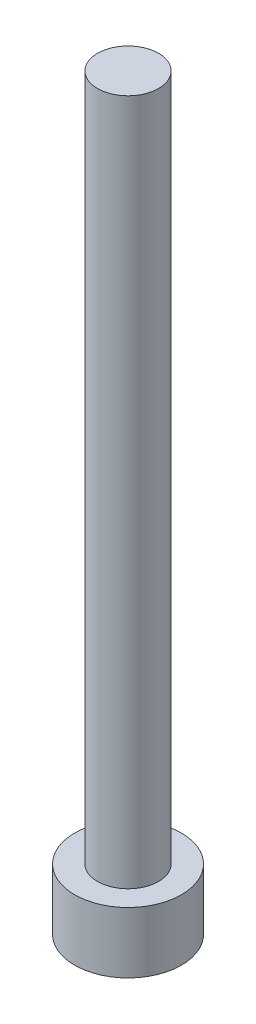
ISO-10303-21;
HEADER;
FILE_DESCRIPTION(('STEP AP214'),'2;1');
FILE_NAME('part.step','',(''),(''),'','','');
FILE_SCHEMA(('AUTOMOTIVE_DESIGN { 1 0 10303 214 1 1 1 1 }'));
ENDSEC;
DATA;
#1=APPLICATION_CONTEXT('core data for automotive mechanical design processes');
#2=APPLICATION_PROTOCOL_DEFINITION('international standard','automotive_design',2000,#1);
#3=PRODUCT_CONTEXT('',#1,'mechanical');
#4=PRODUCT('Part','Part','',(#3));
#5=PRODUCT_RELATED_PRODUCT_CATEGORY('part','',(#4));
#6=PRODUCT_DEFINITION_FORMATION('','',#4);
#7=PRODUCT_DEFINITION_CONTEXT('part definition',#1,'design');
#8=PRODUCT_DEFINITION('design','',#6,#7);
#9=PRODUCT_DEFINITION_SHAPE('','',#8);
#10=(LENGTH_UNIT() NAMED_UNIT(*) SI_UNIT(.MILLI.,.METRE.));
#11=(NAMED_UNIT(*) PLANE_ANGLE_UNIT() SI_UNIT($,.RADIAN.));
#12=(NAMED_UNIT(*) SI_UNIT($,.STERADIAN.) SOLID_ANGLE_UNIT());
#13=UNCERTAINTY_MEASURE_WITH_UNIT(LENGTH_MEASURE(1.E-05),#10,'distance_accuracy_value','');
#14=(GEOMETRIC_REPRESENTATION_CONTEXT(3) GLOBAL_UNCERTAINTY_ASSIGNED_CONTEXT((#13)) GLOBAL_UNIT_ASSIGNED_CONTEXT((#10,
#11,#12)) REPRESENTATION_CONTEXT('',''));
#15=CARTESIAN_POINT('',(0.,0.,0.));
#16=DIRECTION('',(0.,0.,1.));
#17=DIRECTION('',(1.,0.,0.));
#18=AXIS2_PLACEMENT_3D('',#15,#16,#17);
#19=CARTESIAN_POINT('',(0.,45.,0.));
#20=DIRECTION('',(0.,-1.,0.));
#21=DIRECTION('',(0.,0.,-1.));
#22=AXIS2_PLACEMENT_3D('',#19,#20,#21);
#23=CYLINDRICAL_SURFACE('',#22,2.);
#24=CARTESIAN_POINT('',(0.,45.,0.));
#25=DIRECTION('',(0.,1.,0.));
#26=DIRECTION('',(0.,0.,1.));
#27=AXIS2_PLACEMENT_3D('',#24,#25,#26);
#28=CIRCLE('',#27,2.);
#29=CARTESIAN_POINT('',(0.,45.,-2.));
#30=VERTEX_POINT('',#29);
#31=EDGE_CURVE('E10',#30,#30,#28,.T.);
#32=CARTESIAN_POINT('',(0.,0.,0.));
#33=DIRECTION('',(0.,1.,0.));
#34=DIRECTION('',(0.,0.,1.));
#35=AXIS2_PLACEMENT_3D('',#32,#33,#34);
#36=CIRCLE('',#35,2.);
#37=CARTESIAN_POINT('',(0.,0.,-2.));
#38=VERTEX_POINT('',#37);
#39=EDGE_CURVE('E40',#38,#38,#36,.T.);
#40=CARTESIAN_POINT('',(0.,45.,-2.));
#41=CARTESIAN_POINT('',(0.,44.53125,-2.));
#42=CARTESIAN_POINT('',(0.,44.0625,-2.));
#43=CARTESIAN_POINT('',(0.,43.125,-2.));
#44=CARTESIAN_POINT('',(0.,42.65625,-2.));
#45=CARTESIAN_POINT('',(0.,41.71875,-2.));
#46=CARTESIAN_POINT('',(0.,41.25,-2.));
#47=CARTESIAN_POINT('',(0.,40.3125,-2.));
#48=CARTESIAN_POINT('',(0.,39.84375,-2.));
#49=CARTESIAN_POINT('',(0.,38.90625,-2.));
#50=CARTESIAN_POINT('',(0.,38.4375,-2.));
#51=CARTESIAN_POINT('',(0.,37.5,-2.));
#52=CARTESIAN_POINT('',(0.,37.03125,-2.));
#53=CARTESIAN_POINT('',(0.,36.09375,-2.));
#54=CARTESIAN_POINT('',(0.,35.625,-2.));
#55=CARTESIAN_POINT('',(0.,34.6875,-2.));
#56=CARTESIAN_POINT('',(0.,34.21875,-2.));
#57=CARTESIAN_POINT('',(0.,33.28125,-2.));
#58=CARTESIAN_POINT('',(0.,32.8125,-2.));
#59=CARTESIAN_POINT('',(0.,31.875,-2.));
#60=CARTESIAN_POINT('',(0.,31.40625,-2.));
#61=CARTESIAN_POINT('',(0.,30.46875,-2.));
#62=CARTESIAN_POINT('',(0.,30.,-2.));
#63=CARTESIAN_POINT('',(0.,29.0625,-2.));
#64=CARTESIAN_POINT('',(0.,28.59375,-2.));
#65=CARTESIAN_POINT('',(0.,27.65625,-2.));
#66=CARTESIAN_POINT('',(0.,27.1875,-2.));
#67=CARTESIAN_POINT('',(0.,26.25,-2.));
#68=CARTESIAN_POINT('',(0.,25.78125,-2.));
#69=CARTESIAN_POINT('',(0.,24.84375,-2.));
#70=CARTESIAN_POINT('',(0.,24.375,-2.));
#71=CARTESIAN_POINT('',(0.,23.4375,-2.));
#72=CARTESIAN_POINT('',(0.,22.96875,-2.));
#73=CARTESIAN_POINT('',(0.,22.03125,-2.));
#74=CARTESIAN_POINT('',(0.,21.5625,-2.));
#75=CARTESIAN_POINT('',(0.,20.625,-2.));
#76=CARTESIAN_POINT('',(0.,20.15625,-2.));
#77=CARTESIAN_POINT('',(0.,19.21875,-2.));
#78=CARTESIAN_POINT('',(0.,18.75,-2.));
#79=CARTESIAN_POINT('',(0.,17.8125,-2.));
#80=CARTESIAN_POINT('',(0.,17.34375,-2.));
#81=CARTESIAN_POINT('',(0.,16.40625,-2.));
#82=CARTESIAN_POINT('',(0.,15.9375,-2.));
#83=CARTESIAN_POINT('',(0.,15.,-2.));
#84=CARTESIAN_POINT('',(0.,14.53125,-2.));
#85=CARTESIAN_POINT('',(0.,13.59375,-2.));
#86=CARTESIAN_POINT('',(0.,13.125,-2.));
#87=CARTESIAN_POINT('',(0.,12.1875,-2.));
#88=CARTESIAN_POINT('',(0.,11.71875,-2.));
#89=CARTESIAN_POINT('',(0.,10.78125,-2.));
#90=CARTESIAN_POINT('',(0.,10.3125,-2.));
#91=CARTESIAN_POINT('',(0.,9.37499999999999,-2.));
#92=CARTESIAN_POINT('',(0.,8.90624999999999,-2.));
#93=CARTESIAN_POINT('',(0.,7.96874999999999,-2.));
#94=CARTESIAN_POINT('',(0.,7.5,-2.));
#95=CARTESIAN_POINT('',(0.,6.56249999999999,-2.));
#96=CARTESIAN_POINT('',(0.,6.09374999999999,-2.));
#97=CARTESIAN_POINT('',(0.,5.15624999999999,-2.));
#98=CARTESIAN_POINT('',(0.,4.68749999999999,-2.));
#99=CARTESIAN_POINT('',(0.,3.74999999999999,-2.));
#100=CARTESIAN_POINT('',(0.,3.28124999999999,-2.));
#101=CARTESIAN_POINT('',(0.,2.34374999999999,-2.));
#102=CARTESIAN_POINT('',(0.,1.87499999999999,-2.));
#103=CARTESIAN_POINT('',(0.,0.937499999999992,-2.));
#104=CARTESIAN_POINT('',(0.,0.468749999999993,-2.));
#105=CARTESIAN_POINT('',(0.,0.,-2.));
#106=B_SPLINE_CURVE_WITH_KNOTS('',3,(#40,#41,#42,#43,#44,#45,#46,#47,#48,#49,#50,#51,#52,#53,
#54,#55,#56,#57,#58,#59,#60,#61,#62,#63,#64,#65,#66,#67,#68,#69,#70,#71,#72,#73,#74,#75,#76,#77,
#78,#79,#80,#81,#82,#83,#84,#85,#86,#87,#88,#89,#90,#91,#92,#93,#94,#95,#96,#97,#98,#99,#100,
#101,#102,#103,#104,#105),.UNSPECIFIED.,.F.,.F.,(4,2,2,2,2,2,2,2,2,2,2,2,2,2,2,2,2,2,2,2,2,2,2,
2,2,2,2,2,2,2,2,2,4),(0.,1.40625,2.8125,4.21874999999999,5.625,7.03125,8.43749999999999,9.84375,
11.25,12.65625,14.0625,15.46875,16.875,18.28125,19.6875,21.09375,22.5,23.90625,25.3125,26.71875,
28.125,29.53125,30.9375,32.34375,33.75,35.15625,36.5625,37.96875,39.375,40.78125,42.1875,
43.59375,45.),.UNSPECIFIED.);
#107=EDGE_CURVE('BSEAM37',#30,#38,#106,.T.);
#108=ORIENTED_EDGE('',*,*,#31,.F.);
#109=ORIENTED_EDGE('',*,*,#39,.T.);
#110=ORIENTED_EDGE('',*,*,#107,.T.);
#111=ORIENTED_EDGE('',*,*,#107,.F.);
#112=EDGE_LOOP('',(#108,#110,#109,#111));
#113=FACE_BOUND('',#112,.T.);
#114=ADVANCED_FACE('F37',(#113),#23,.T.);
#115=CARTESIAN_POINT('',(0.,45.,0.));
#116=DIRECTION('',(0.,1.,0.));
#117=DIRECTION('',(0.,0.,1.));
#118=AXIS2_PLACEMENT_3D('',#115,#116,#117);
#119=PLANE('',#118);
#120=ORIENTED_EDGE('',*,*,#31,.T.);
#121=EDGE_LOOP('',(#120));
#122=FACE_BOUND('',#121,.T.);
#123=ADVANCED_FACE('F64',(#122),#119,.T.);
#124=CARTESIAN_POINT('',(0.,-4.,0.));
#125=DIRECTION('',(0.,1.,0.));
#126=DIRECTION('',(0.,0.,1.));
#127=AXIS2_PLACEMENT_3D('',#124,#125,#126);
#128=CYLINDRICAL_SURFACE('',#127,3.5);
#129=CARTESIAN_POINT('',(0.,-4.,0.));
#130=DIRECTION('',(0.,-1.,0.));
#131=DIRECTION('',(0.,0.,-1.));
#132=AXIS2_PLACEMENT_3D('',#129,#130,#131);
#133=CIRCLE('',#132,3.5);
#134=CARTESIAN_POINT('',(0.,-4.,-3.5));
#135=VERTEX_POINT('',#134);
#136=EDGE_CURVE('E49',#135,#135,#133,.T.);
#137=ORIENTED_EDGE('',*,*,#136,.F.);
#138=EDGE_LOOP('',(#137));
#139=FACE_BOUND('',#138,.T.);
#140=CARTESIAN_POINT('',(0.,0.,0.));
#141=DIRECTION('',(0.,-1.,0.));
#142=DIRECTION('',(0.,0.,-1.));
#143=AXIS2_PLACEMENT_3D('',#140,#141,#142);
#144=CIRCLE('',#143,3.5);
#145=CARTESIAN_POINT('',(0.,0.,-3.5));
#146=VERTEX_POINT('',#145);
#147=EDGE_CURVE('E51',#146,#146,#144,.T.);
#148=ORIENTED_EDGE('',*,*,#147,.T.);
#149=EDGE_LOOP('',(#148));
#150=FACE_BOUND('',#149,.T.);
#151=ADVANCED_FACE('F61',(#139,#150),#128,.T.);
#152=CARTESIAN_POINT('',(0.,-4.,0.));
#153=DIRECTION('',(0.,-1.,0.));
#154=DIRECTION('',(0.,0.,-1.));
#155=AXIS2_PLACEMENT_3D('',#152,#153,#154);
#156=PLANE('',#155);
#157=ORIENTED_EDGE('',*,*,#136,.T.);
#158=EDGE_LOOP('',(#157));
#159=FACE_BOUND('',#158,.T.);
#160=ADVANCED_FACE('F59',(#159),#156,.T.);
#161=CARTESIAN_POINT('',(0.,0.,0.));
#162=DIRECTION('',(0.,-1.,0.));
#163=DIRECTION('',(0.,0.,-1.));
#164=AXIS2_PLACEMENT_3D('',#161,#162,#163);
#165=PLANE('',#164);
#166=ORIENTED_EDGE('',*,*,#39,.F.);
#167=EDGE_LOOP('',(#166));
#168=FACE_BOUND('',#167,.T.);
#169=ORIENTED_EDGE('',*,*,#147,.F.);
#170=EDGE_LOOP('',(#169));
#171=FACE_BOUND('',#170,.T.);
#172=ADVANCED_FACE('F68',(#168,#171),#165,.F.);
#173=CLOSED_SHELL('',(#114,#123,#151,#160,#172));
#174=MANIFOLD_SOLID_BREP('B2',#173);
#175=ADVANCED_BREP_SHAPE_REPRESENTATION('',(#18,#174),#14);
#176=SHAPE_DEFINITION_REPRESENTATION(#9,#175);
ENDSEC;
END-ISO-10303-21;
